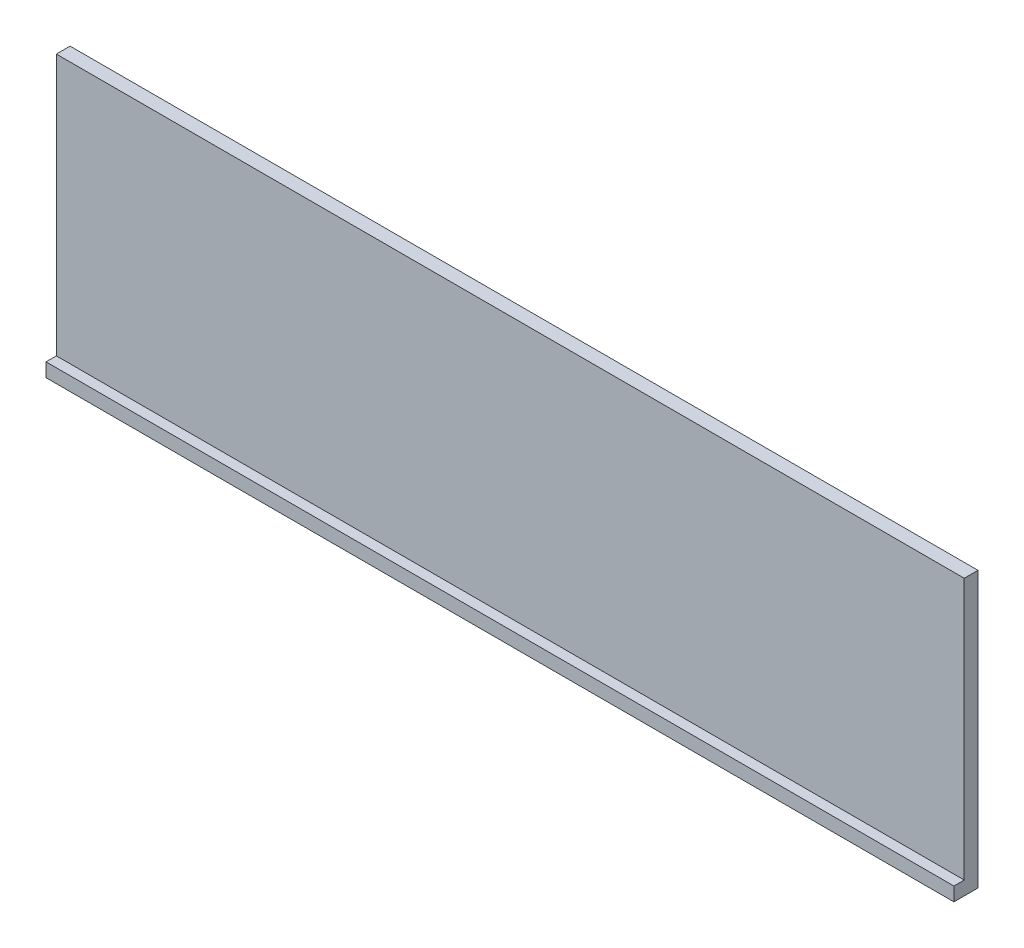
ISO-10303-21;
HEADER;
FILE_DESCRIPTION(('STEP AP214'),'2;1');
FILE_NAME('part.step','',(''),(''),'','','');
FILE_SCHEMA(('AUTOMOTIVE_DESIGN { 1 0 10303 214 1 1 1 1 }'));
ENDSEC;
DATA;
#1=APPLICATION_CONTEXT('core data for automotive mechanical design processes');
#2=APPLICATION_PROTOCOL_DEFINITION('international standard','automotive_design',2000,#1);
#3=PRODUCT_CONTEXT('',#1,'mechanical');
#4=PRODUCT('Part','Part','',(#3));
#5=PRODUCT_RELATED_PRODUCT_CATEGORY('part','',(#4));
#6=PRODUCT_DEFINITION_FORMATION('','',#4);
#7=PRODUCT_DEFINITION_CONTEXT('part definition',#1,'design');
#8=PRODUCT_DEFINITION('design','',#6,#7);
#9=PRODUCT_DEFINITION_SHAPE('','',#8);
#10=(LENGTH_UNIT() NAMED_UNIT(*) SI_UNIT(.MILLI.,.METRE.));
#11=(NAMED_UNIT(*) PLANE_ANGLE_UNIT() SI_UNIT($,.RADIAN.));
#12=(NAMED_UNIT(*) SI_UNIT($,.STERADIAN.) SOLID_ANGLE_UNIT());
#13=UNCERTAINTY_MEASURE_WITH_UNIT(LENGTH_MEASURE(1.E-05),#10,'distance_accuracy_value','');
#14=(GEOMETRIC_REPRESENTATION_CONTEXT(3) GLOBAL_UNCERTAINTY_ASSIGNED_CONTEXT((#13)) GLOBAL_UNIT_ASSIGNED_CONTEXT((#10,
#11,#12)) REPRESENTATION_CONTEXT('',''));
#15=CARTESIAN_POINT('',(0.,0.,0.));
#16=DIRECTION('',(0.,0.,1.));
#17=DIRECTION('',(1.,0.,0.));
#18=AXIS2_PLACEMENT_3D('',#15,#16,#17);
#19=CARTESIAN_POINT('',(-29.9266503667482,22.059902200489,2.));
#20=DIRECTION('',(1.,0.,0.));
#21=DIRECTION('',(0.,1.,0.));
#22=AXIS2_PLACEMENT_3D('',#19,#20,#21);
#23=PLANE('',#22);
#24=DIRECTION('',(0.,-1.,0.));
#25=VECTOR('',#24,1.);
#26=CARTESIAN_POINT('',(-29.9266503667482,22.059902200489,0.));
#27=LINE('',#26,#25);
#28=CARTESIAN_POINT('',(-29.9266503667482,22.059902200489,0.));
#29=VERTEX_POINT('',#28);
#30=CARTESIAN_POINT('',(-29.9266503667482,-17.940097799511,0.));
#31=VERTEX_POINT('',#30);
#32=EDGE_CURVE('E100',#29,#31,#27,.T.);
#33=ORIENTED_EDGE('',*,*,#32,.T.);
#34=DIRECTION('',(0.,0.,-1.));
#35=VECTOR('',#34,1.);
#36=CARTESIAN_POINT('',(-29.9266503667482,-17.940097799511,2.));
#37=LINE('',#36,#35);
#38=CARTESIAN_POINT('',(-29.9266503667482,-17.940097799511,3.5));
#39=VERTEX_POINT('',#38);
#40=EDGE_CURVE('E11',#39,#31,#37,.T.);
#41=ORIENTED_EDGE('',*,*,#40,.F.);
#42=DIRECTION('',(0.,-1.,0.));
#43=VECTOR('',#42,1.);
#44=CARTESIAN_POINT('',(-29.9266503667482,-15.940097799511,3.5));
#45=LINE('',#44,#43);
#46=CARTESIAN_POINT('',(-29.9266503667482,-15.940097799511,3.5));
#47=VERTEX_POINT('',#46);
#48=EDGE_CURVE('E144',#47,#39,#45,.T.);
#49=ORIENTED_EDGE('',*,*,#48,.F.);
#50=DIRECTION('',(0.,0.,-1.));
#51=VECTOR('',#50,1.);
#52=CARTESIAN_POINT('',(-29.9266503667482,-15.940097799511,3.5));
#53=LINE('',#52,#51);
#54=CARTESIAN_POINT('',(-29.9266503667482,-15.940097799511,2.));
#55=VERTEX_POINT('',#54);
#56=EDGE_CURVE('E113',#47,#55,#53,.T.);
#57=ORIENTED_EDGE('',*,*,#56,.T.);
#58=DIRECTION('',(0.,-1.,0.));
#59=VECTOR('',#58,1.);
#60=CARTESIAN_POINT('',(-29.9266503667482,22.059902200489,2.));
#61=LINE('',#60,#59);
#62=CARTESIAN_POINT('',(-29.9266503667482,22.059902200489,2.));
#63=VERTEX_POINT('',#62);
#64=EDGE_CURVE('E94',#63,#55,#61,.T.);
#65=ORIENTED_EDGE('',*,*,#64,.F.);
#66=DIRECTION('',(0.,0.,-1.));
#67=VECTOR('',#66,1.);
#68=CARTESIAN_POINT('',(-29.9266503667482,22.059902200489,2.));
#69=LINE('',#68,#67);
#70=EDGE_CURVE('E86',#63,#29,#69,.T.);
#71=ORIENTED_EDGE('',*,*,#70,.T.);
#72=EDGE_LOOP('',(#33,#41,#49,#57,#65,#71));
#73=FACE_BOUND('',#72,.T.);
#74=ADVANCED_FACE('F43',(#73),#23,.F.);
#75=CARTESIAN_POINT('',(-29.9266503667482,-17.940097799511,2.));
#76=DIRECTION('',(0.,1.,0.));
#77=DIRECTION('',(0.,0.,1.));
#78=AXIS2_PLACEMENT_3D('',#75,#76,#77);
#79=PLANE('',#78);
#80=DIRECTION('',(1.,0.,0.));
#81=VECTOR('',#80,1.);
#82=CARTESIAN_POINT('',(-29.9266503667482,-17.940097799511,0.));
#83=LINE('',#82,#81);
#84=CARTESIAN_POINT('',(102.073349633252,-17.940097799511,0.));
#85=VERTEX_POINT('',#84);
#86=EDGE_CURVE('E105',#31,#85,#83,.T.);
#87=ORIENTED_EDGE('',*,*,#86,.T.);
#88=DIRECTION('',(0.,0.,-1.));
#89=VECTOR('',#88,1.);
#90=CARTESIAN_POINT('',(102.073349633252,-17.940097799511,2.));
#91=LINE('',#90,#89);
#92=CARTESIAN_POINT('',(102.073349633252,-17.940097799511,3.5));
#93=VERTEX_POINT('',#92);
#94=EDGE_CURVE('E51',#93,#85,#91,.T.);
#95=ORIENTED_EDGE('',*,*,#94,.F.);
#96=DIRECTION('',(1.,0.,0.));
#97=VECTOR('',#96,1.);
#98=CARTESIAN_POINT('',(-29.9266503667482,-17.940097799511,3.5));
#99=LINE('',#98,#97);
#100=EDGE_CURVE('E136',#39,#93,#99,.T.);
#101=ORIENTED_EDGE('',*,*,#100,.F.);
#102=ORIENTED_EDGE('',*,*,#40,.T.);
#103=EDGE_LOOP('',(#87,#95,#101,#102));
#104=FACE_BOUND('',#103,.T.);
#105=ADVANCED_FACE('F134',(#104),#79,.F.);
#106=CARTESIAN_POINT('',(102.073349633252,22.059902200489,2.));
#107=DIRECTION('',(-1.,0.,0.));
#108=DIRECTION('',(0.,-1.,0.));
#109=AXIS2_PLACEMENT_3D('',#106,#107,#108);
#110=PLANE('',#109);
#111=DIRECTION('',(0.,1.,0.));
#112=VECTOR('',#111,1.);
#113=CARTESIAN_POINT('',(102.073349633252,22.059902200489,0.));
#114=LINE('',#113,#112);
#115=CARTESIAN_POINT('',(102.073349633252,22.059902200489,0.));
#116=VERTEX_POINT('',#115);
#117=EDGE_CURVE('E95',#85,#116,#114,.T.);
#118=ORIENTED_EDGE('',*,*,#117,.T.);
#119=DIRECTION('',(0.,0.,-1.));
#120=VECTOR('',#119,1.);
#121=CARTESIAN_POINT('',(102.073349633252,22.059902200489,2.));
#122=LINE('',#121,#120);
#123=CARTESIAN_POINT('',(102.073349633252,22.059902200489,2.));
#124=VERTEX_POINT('',#123);
#125=EDGE_CURVE('E89',#124,#116,#122,.T.);
#126=ORIENTED_EDGE('',*,*,#125,.F.);
#127=DIRECTION('',(0.,1.,0.));
#128=VECTOR('',#127,1.);
#129=CARTESIAN_POINT('',(102.073349633252,22.059902200489,2.));
#130=LINE('',#129,#128);
#131=CARTESIAN_POINT('',(102.073349633252,-15.940097799511,2.));
#132=VERTEX_POINT('',#131);
#133=EDGE_CURVE('E160',#132,#124,#130,.T.);
#134=ORIENTED_EDGE('',*,*,#133,.F.);
#135=DIRECTION('',(0.,0.,-1.));
#136=VECTOR('',#135,1.);
#137=CARTESIAN_POINT('',(102.073349633252,-15.940097799511,3.5));
#138=LINE('',#137,#136);
#139=CARTESIAN_POINT('',(102.073349633252,-15.940097799511,3.5));
#140=VERTEX_POINT('',#139);
#141=EDGE_CURVE('E107',#140,#132,#138,.T.);
#142=ORIENTED_EDGE('',*,*,#141,.F.);
#143=DIRECTION('',(0.,1.,0.));
#144=VECTOR('',#143,1.);
#145=CARTESIAN_POINT('',(102.073349633252,-17.940097799511,3.5));
#146=LINE('',#145,#144);
#147=EDGE_CURVE('E130',#93,#140,#146,.T.);
#148=ORIENTED_EDGE('',*,*,#147,.F.);
#149=ORIENTED_EDGE('',*,*,#94,.T.);
#150=EDGE_LOOP('',(#118,#126,#134,#142,#148,#149));
#151=FACE_BOUND('',#150,.T.);
#152=ADVANCED_FACE('F126',(#151),#110,.F.);
#153=CARTESIAN_POINT('',(-29.9266503667482,22.059902200489,2.));
#154=DIRECTION('',(0.,-1.,0.));
#155=DIRECTION('',(0.,0.,-1.));
#156=AXIS2_PLACEMENT_3D('',#153,#154,#155);
#157=PLANE('',#156);
#158=DIRECTION('',(-1.,0.,0.));
#159=VECTOR('',#158,1.);
#160=CARTESIAN_POINT('',(-29.9266503667482,22.059902200489,0.));
#161=LINE('',#160,#159);
#162=EDGE_CURVE('E83',#116,#29,#161,.T.);
#163=ORIENTED_EDGE('',*,*,#162,.T.);
#164=ORIENTED_EDGE('',*,*,#70,.F.);
#165=DIRECTION('',(-1.,0.,0.));
#166=VECTOR('',#165,1.);
#167=CARTESIAN_POINT('',(-29.9266503667482,22.059902200489,2.));
#168=LINE('',#167,#166);
#169=EDGE_CURVE('E64',#124,#63,#168,.T.);
#170=ORIENTED_EDGE('',*,*,#169,.F.);
#171=ORIENTED_EDGE('',*,*,#125,.T.);
#172=EDGE_LOOP('',(#163,#164,#170,#171));
#173=FACE_BOUND('',#172,.T.);
#174=ADVANCED_FACE('F85',(#173),#157,.F.);
#175=CARTESIAN_POINT('',(0.,0.,2.));
#176=DIRECTION('',(0.,0.,1.));
#177=DIRECTION('',(1.,0.,0.));
#178=AXIS2_PLACEMENT_3D('',#175,#176,#177);
#179=PLANE('',#178);
#180=DIRECTION('',(-1.,0.,0.));
#181=VECTOR('',#180,1.);
#182=CARTESIAN_POINT('',(-29.9266503667482,-15.940097799511,2.));
#183=LINE('',#182,#181);
#184=EDGE_CURVE('E58',#132,#55,#183,.T.);
#185=ORIENTED_EDGE('',*,*,#184,.F.);
#186=ORIENTED_EDGE('',*,*,#133,.T.);
#187=ORIENTED_EDGE('',*,*,#169,.T.);
#188=ORIENTED_EDGE('',*,*,#64,.T.);
#189=EDGE_LOOP('',(#185,#186,#187,#188));
#190=FACE_BOUND('',#189,.T.);
#191=ADVANCED_FACE('F163',(#190),#179,.T.);
#192=CARTESIAN_POINT('',(0.,0.,0.));
#193=DIRECTION('',(0.,0.,1.));
#194=DIRECTION('',(1.,0.,0.));
#195=AXIS2_PLACEMENT_3D('',#192,#193,#194);
#196=PLANE('',#195);
#197=ORIENTED_EDGE('',*,*,#32,.F.);
#198=ORIENTED_EDGE('',*,*,#162,.F.);
#199=ORIENTED_EDGE('',*,*,#117,.F.);
#200=ORIENTED_EDGE('',*,*,#86,.F.);
#201=EDGE_LOOP('',(#197,#198,#199,#200));
#202=FACE_BOUND('',#201,.T.);
#203=ADVANCED_FACE('F104',(#202),#196,.F.);
#204=CARTESIAN_POINT('',(-29.9266503667482,-15.940097799511,3.5));
#205=DIRECTION('',(0.,-1.,0.));
#206=DIRECTION('',(1.,0.,0.));
#207=AXIS2_PLACEMENT_3D('',#204,#205,#206);
#208=PLANE('',#207);
#209=ORIENTED_EDGE('',*,*,#184,.T.);
#210=ORIENTED_EDGE('',*,*,#56,.F.);
#211=DIRECTION('',(-1.,0.,0.));
#212=VECTOR('',#211,1.);
#213=CARTESIAN_POINT('',(-29.9266503667482,-15.940097799511,3.5));
#214=LINE('',#213,#212);
#215=EDGE_CURVE('E149',#140,#47,#214,.T.);
#216=ORIENTED_EDGE('',*,*,#215,.F.);
#217=ORIENTED_EDGE('',*,*,#141,.T.);
#218=EDGE_LOOP('',(#209,#210,#216,#217));
#219=FACE_BOUND('',#218,.T.);
#220=ADVANCED_FACE('F166',(#219),#208,.F.);
#221=CARTESIAN_POINT('',(0.,0.,3.5));
#222=DIRECTION('',(0.,0.,1.));
#223=DIRECTION('',(1.,0.,0.));
#224=AXIS2_PLACEMENT_3D('',#221,#222,#223);
#225=PLANE('',#224);
#226=ORIENTED_EDGE('',*,*,#48,.T.);
#227=ORIENTED_EDGE('',*,*,#100,.T.);
#228=ORIENTED_EDGE('',*,*,#147,.T.);
#229=ORIENTED_EDGE('',*,*,#215,.T.);
#230=EDGE_LOOP('',(#226,#227,#228,#229));
#231=FACE_BOUND('',#230,.T.);
#232=ADVANCED_FACE('F141',(#231),#225,.T.);
#233=CLOSED_SHELL('',(#74,#105,#152,#174,#191,#203,#220,#232));
#234=MANIFOLD_SOLID_BREP('B2',#233);
#235=ADVANCED_BREP_SHAPE_REPRESENTATION('',(#18,#234),#14);
#236=SHAPE_DEFINITION_REPRESENTATION(#9,#235);
ENDSEC;
END-ISO-10303-21;
